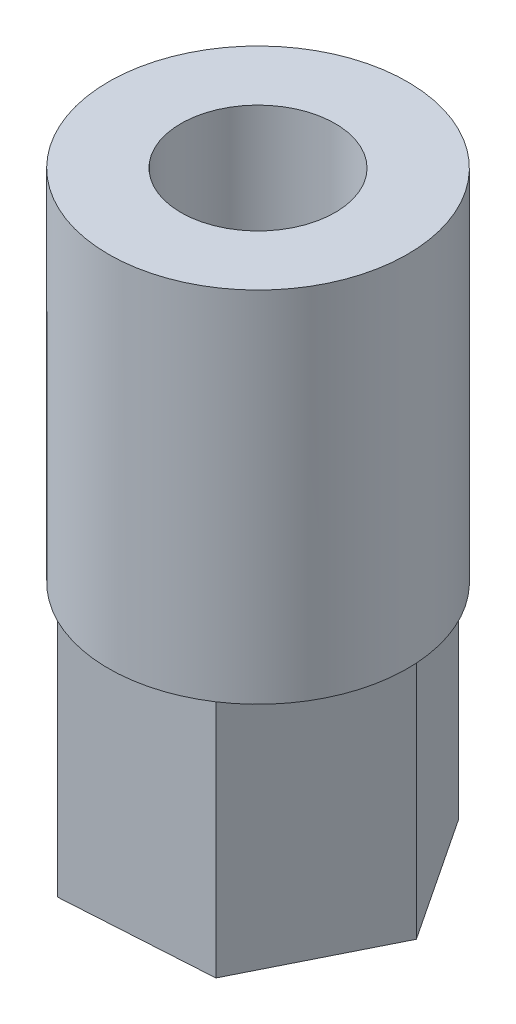
ISO-10303-21;
HEADER;
FILE_DESCRIPTION(('STEP AP214'),'2;1');
FILE_NAME('part.step','',(''),(''),'','','');
FILE_SCHEMA(('AUTOMOTIVE_DESIGN { 1 0 10303 214 1 1 1 1 }'));
ENDSEC;
DATA;
#1=APPLICATION_CONTEXT('core data for automotive mechanical design processes');
#2=APPLICATION_PROTOCOL_DEFINITION('international standard','automotive_design',2000,#1);
#3=PRODUCT_CONTEXT('',#1,'mechanical');
#4=PRODUCT('Part','Part','',(#3));
#5=PRODUCT_RELATED_PRODUCT_CATEGORY('part','',(#4));
#6=PRODUCT_DEFINITION_FORMATION('','',#4);
#7=PRODUCT_DEFINITION_CONTEXT('part definition',#1,'design');
#8=PRODUCT_DEFINITION('design','',#6,#7);
#9=PRODUCT_DEFINITION_SHAPE('','',#8);
#10=(LENGTH_UNIT() NAMED_UNIT(*) SI_UNIT(.MILLI.,.METRE.));
#11=(NAMED_UNIT(*) PLANE_ANGLE_UNIT() SI_UNIT($,.RADIAN.));
#12=(NAMED_UNIT(*) SI_UNIT($,.STERADIAN.) SOLID_ANGLE_UNIT());
#13=UNCERTAINTY_MEASURE_WITH_UNIT(LENGTH_MEASURE(1.E-05),#10,'distance_accuracy_value','');
#14=(GEOMETRIC_REPRESENTATION_CONTEXT(3) GLOBAL_UNCERTAINTY_ASSIGNED_CONTEXT((#13)) GLOBAL_UNIT_ASSIGNED_CONTEXT((#10,
#11,#12)) REPRESENTATION_CONTEXT('',''));
#15=CARTESIAN_POINT('',(0.,0.,0.));
#16=DIRECTION('',(0.,0.,1.));
#17=DIRECTION('',(1.,0.,0.));
#18=AXIS2_PLACEMENT_3D('',#15,#16,#17);
#19=CARTESIAN_POINT('',(0.,0.,0.));
#20=DIRECTION('',(0.,1.,0.));
#21=DIRECTION('',(0.,0.,1.));
#22=AXIS2_PLACEMENT_3D('',#19,#20,#21);
#23=PLANE('',#22);
#24=DIRECTION('',(-0.998134620038051,0.,0.0610514560145483));
#25=VECTOR('',#24,1.);
#26=CARTESIAN_POINT('',(1.75240766442344,0.,2.64758236466214));
#27=LINE('',#26,#25);
#28=CARTESIAN_POINT('',(1.75240766442344,0.,2.64758236466214));
#29=VERTEX_POINT('',#28);
#30=CARTESIAN_POINT('',(-1.41666975419736,0.,2.84142073750833));
#31=VERTEX_POINT('',#30);
#32=EDGE_CURVE('E112',#29,#31,#27,.T.);
#33=ORIENTED_EDGE('',*,*,#32,.F.);
#34=CARTESIAN_POINT('',(0.,0.,0.));
#35=DIRECTION('',(0.,1.,0.));
#36=DIRECTION('',(0.,0.,1.));
#37=AXIS2_PLACEMENT_3D('',#34,#35,#36);
#38=CIRCLE('',#37,3.175);
#39=EDGE_CURVE('E113',#31,#29,#38,.T.);
#40=ORIENTED_EDGE('',*,*,#39,.F.);
#41=EDGE_LOOP('',(#33,#40));
#42=FACE_BOUND('',#41,.T.);
#43=ADVANCED_FACE('F34',(#42),#23,.F.);
#44=DIRECTION('',(-0.446195198172399,0.,0.894935665356954));
#45=VECTOR('',#44,1.);
#46=CARTESIAN_POINT('',(3.16907741862081,0.,-0.193838372846189));
#47=LINE('',#46,#45);
#48=CARTESIAN_POINT('',(3.16907741862081,0.,-0.193838372846187));
#49=VERTEX_POINT('',#48);
#50=EDGE_CURVE('E109',#49,#29,#47,.T.);
#51=ORIENTED_EDGE('',*,*,#50,.F.);
#52=EDGE_CURVE('E38',#29,#49,#38,.T.);
#53=ORIENTED_EDGE('',*,*,#52,.F.);
#54=EDGE_LOOP('',(#51,#53));
#55=FACE_BOUND('',#54,.T.);
#56=ADVANCED_FACE('F187',(#55),#23,.F.);
#57=DIRECTION('',(0.551939421865652,0.,0.833884209342406));
#58=VECTOR('',#57,1.);
#59=CARTESIAN_POINT('',(1.41666975419736,0.,-2.84142073750833));
#60=LINE('',#59,#58);
#61=CARTESIAN_POINT('',(1.41666975419736,0.,-2.84142073750833));
#62=VERTEX_POINT('',#61);
#63=EDGE_CURVE('E132',#62,#49,#60,.T.);
#64=ORIENTED_EDGE('',*,*,#63,.F.);
#65=EDGE_CURVE('E176',#49,#62,#38,.T.);
#66=ORIENTED_EDGE('',*,*,#65,.F.);
#67=EDGE_LOOP('',(#64,#66));
#68=FACE_BOUND('',#67,.T.);
#69=ADVANCED_FACE('F188',(#68),#23,.F.);
#70=DIRECTION('',(0.998134620038051,0.,-0.0610514560145496));
#71=VECTOR('',#70,1.);
#72=CARTESIAN_POINT('',(-1.75240766442345,0.,-2.64758236466213));
#73=LINE('',#72,#71);
#74=CARTESIAN_POINT('',(-1.75240766442344,0.,-2.64758236466214));
#75=VERTEX_POINT('',#74);
#76=EDGE_CURVE('E55',#75,#62,#73,.T.);
#77=ORIENTED_EDGE('',*,*,#76,.F.);
#78=EDGE_CURVE('E189',#62,#75,#38,.T.);
#79=ORIENTED_EDGE('',*,*,#78,.F.);
#80=EDGE_LOOP('',(#77,#79));
#81=FACE_BOUND('',#80,.T.);
#82=ADVANCED_FACE('F217',(#81),#23,.F.);
#83=DIRECTION('',(0.446195198172398,0.,-0.894935665356955));
#84=VECTOR('',#83,1.);
#85=CARTESIAN_POINT('',(-3.16907741862081,0.,0.193838372846192));
#86=LINE('',#85,#84);
#87=CARTESIAN_POINT('',(-3.16907741862081,0.,0.193838372846192));
#88=VERTEX_POINT('',#87);
#89=EDGE_CURVE('E136',#88,#75,#86,.T.);
#90=ORIENTED_EDGE('',*,*,#89,.F.);
#91=EDGE_CURVE('E190',#75,#88,#38,.T.);
#92=ORIENTED_EDGE('',*,*,#91,.F.);
#93=EDGE_LOOP('',(#90,#92));
#94=FACE_BOUND('',#93,.T.);
#95=ADVANCED_FACE('F193',(#94),#23,.F.);
#96=DIRECTION('',(-0.551939421865652,0.,-0.833884209342406));
#97=VECTOR('',#96,1.);
#98=CARTESIAN_POINT('',(-1.41666975419736,0.,2.84142073750833));
#99=LINE('',#98,#97);
#100=EDGE_CURVE('E48',#31,#88,#99,.T.);
#101=ORIENTED_EDGE('',*,*,#100,.F.);
#102=EDGE_CURVE('E116',#88,#31,#38,.T.);
#103=ORIENTED_EDGE('',*,*,#102,.F.);
#104=EDGE_LOOP('',(#101,#103));
#105=FACE_BOUND('',#104,.T.);
#106=ADVANCED_FACE('F170',(#105),#23,.F.);
#107=CARTESIAN_POINT('',(0.,7.62,0.));
#108=DIRECTION('',(0.,-1.,0.));
#109=DIRECTION('',(0.,0.,-1.));
#110=AXIS2_PLACEMENT_3D('',#107,#108,#109);
#111=CYLINDRICAL_SURFACE('',#110,3.175);
#112=CARTESIAN_POINT('',(0.,7.62,0.));
#113=DIRECTION('',(0.,1.,0.));
#114=DIRECTION('',(0.,0.,1.));
#115=AXIS2_PLACEMENT_3D('',#112,#113,#114);
#116=CIRCLE('',#115,3.175);
#117=CARTESIAN_POINT('',(0.,7.62,3.175));
#118=VERTEX_POINT('',#117);
#119=EDGE_CURVE('E11',#118,#118,#116,.T.);
#120=ORIENTED_EDGE('',*,*,#119,.F.);
#121=EDGE_LOOP('',(#120));
#122=FACE_BOUND('',#121,.T.);
#123=ORIENTED_EDGE('',*,*,#52,.T.);
#124=ORIENTED_EDGE('',*,*,#65,.T.);
#125=ORIENTED_EDGE('',*,*,#78,.T.);
#126=ORIENTED_EDGE('',*,*,#91,.T.);
#127=ORIENTED_EDGE('',*,*,#102,.T.);
#128=ORIENTED_EDGE('',*,*,#39,.T.);
#129=EDGE_LOOP('',(#123,#124,#125,#126,#127,#128));
#130=FACE_BOUND('',#129,.T.);
#131=ADVANCED_FACE('F36',(#122,#130),#111,.T.);
#132=CARTESIAN_POINT('',(0.,7.62,0.));
#133=DIRECTION('',(0.,1.,0.));
#134=DIRECTION('',(0.,0.,1.));
#135=AXIS2_PLACEMENT_3D('',#132,#133,#134);
#136=PLANE('',#135);
#137=CARTESIAN_POINT('',(0.,7.62,0.));
#138=DIRECTION('',(0.,1.,0.));
#139=DIRECTION('',(0.,0.,1.));
#140=AXIS2_PLACEMENT_3D('',#137,#138,#139);
#141=CIRCLE('',#140,1.6383);
#142=CARTESIAN_POINT('',(0.,7.62,1.6383));
#143=VERTEX_POINT('',#142);
#144=EDGE_CURVE('E148',#143,#143,#141,.T.);
#145=ORIENTED_EDGE('',*,*,#144,.F.);
#146=EDGE_LOOP('',(#145));
#147=FACE_BOUND('',#146,.T.);
#148=ORIENTED_EDGE('',*,*,#119,.T.);
#149=EDGE_LOOP('',(#148));
#150=FACE_BOUND('',#149,.T.);
#151=ADVANCED_FACE('F162',(#147,#150),#136,.T.);
#152=CARTESIAN_POINT('',(1.75240766442344,-5.08,2.64758236466214));
#153=DIRECTION('',(-0.0610514560145483,0.,-0.998134620038051));
#154=DIRECTION('',(-0.998134620038051,0.,0.0610514560145483));
#155=AXIS2_PLACEMENT_3D('',#152,#153,#154);
#156=PLANE('',#155);
#157=ORIENTED_EDGE('',*,*,#32,.T.);
#158=DIRECTION('',(0.,1.,0.));
#159=VECTOR('',#158,1.);
#160=CARTESIAN_POINT('',(-1.41666975419736,-5.08,2.84142073750833));
#161=LINE('',#160,#159);
#162=CARTESIAN_POINT('',(-1.41666975419736,-5.08,2.84142073750833));
#163=VERTEX_POINT('',#162);
#164=EDGE_CURVE('E93',#163,#31,#161,.T.);
#165=ORIENTED_EDGE('',*,*,#164,.F.);
#166=DIRECTION('',(-0.998134620038051,0.,0.0610514560145483));
#167=VECTOR('',#166,1.);
#168=CARTESIAN_POINT('',(1.75240766442344,-5.08,2.64758236466214));
#169=LINE('',#168,#167);
#170=CARTESIAN_POINT('',(1.75240766442344,-5.08,2.64758236466214));
#171=VERTEX_POINT('',#170);
#172=EDGE_CURVE('E100',#171,#163,#169,.T.);
#173=ORIENTED_EDGE('',*,*,#172,.F.);
#174=DIRECTION('',(0.,1.,0.));
#175=VECTOR('',#174,1.);
#176=CARTESIAN_POINT('',(1.75240766442344,-5.08,2.64758236466214));
#177=LINE('',#176,#175);
#178=EDGE_CURVE('E128',#171,#29,#177,.T.);
#179=ORIENTED_EDGE('',*,*,#178,.T.);
#180=EDGE_LOOP('',(#157,#165,#173,#179));
#181=FACE_BOUND('',#180,.T.);
#182=ADVANCED_FACE('F111',(#181),#156,.F.);
#183=CARTESIAN_POINT('',(-1.41666975419736,-5.08,2.84142073750833));
#184=DIRECTION('',(0.833884209342406,0.,-0.551939421865652));
#185=DIRECTION('',(-0.551939421865652,0.,-0.833884209342406));
#186=AXIS2_PLACEMENT_3D('',#183,#184,#185);
#187=PLANE('',#186);
#188=ORIENTED_EDGE('',*,*,#100,.T.);
#189=DIRECTION('',(0.,1.,0.));
#190=VECTOR('',#189,1.);
#191=CARTESIAN_POINT('',(-3.16907741862081,-5.08,0.193838372846192));
#192=LINE('',#191,#190);
#193=CARTESIAN_POINT('',(-3.16907741862081,-5.08,0.193838372846192));
#194=VERTEX_POINT('',#193);
#195=EDGE_CURVE('E96',#194,#88,#192,.T.);
#196=ORIENTED_EDGE('',*,*,#195,.F.);
#197=DIRECTION('',(-0.551939421865652,0.,-0.833884209342406));
#198=VECTOR('',#197,1.);
#199=CARTESIAN_POINT('',(-1.41666975419736,-5.08,2.84142073750833));
#200=LINE('',#199,#198);
#201=EDGE_CURVE('E89',#163,#194,#200,.T.);
#202=ORIENTED_EDGE('',*,*,#201,.F.);
#203=ORIENTED_EDGE('',*,*,#164,.T.);
#204=EDGE_LOOP('',(#188,#196,#202,#203));
#205=FACE_BOUND('',#204,.T.);
#206=ADVANCED_FACE('F91',(#205),#187,.F.);
#207=CARTESIAN_POINT('',(-3.16907741862081,-5.08,0.193838372846192));
#208=DIRECTION('',(0.894935665356954,0.,0.446195198172398));
#209=DIRECTION('',(0.446195198172398,0.,-0.894935665356954));
#210=AXIS2_PLACEMENT_3D('',#207,#208,#209);
#211=PLANE('',#210);
#212=ORIENTED_EDGE('',*,*,#89,.T.);
#213=DIRECTION('',(0.,1.,0.));
#214=VECTOR('',#213,1.);
#215=CARTESIAN_POINT('',(-1.75240766442345,-5.08,-2.64758236466213));
#216=LINE('',#215,#214);
#217=CARTESIAN_POINT('',(-1.75240766442345,-5.08,-2.64758236466213));
#218=VERTEX_POINT('',#217);
#219=EDGE_CURVE('E117',#218,#75,#216,.T.);
#220=ORIENTED_EDGE('',*,*,#219,.F.);
#221=DIRECTION('',(0.446195198172398,0.,-0.894935665356955));
#222=VECTOR('',#221,1.);
#223=CARTESIAN_POINT('',(-3.16907741862081,-5.08,0.193838372846192));
#224=LINE('',#223,#222);
#225=EDGE_CURVE('E99',#194,#218,#224,.T.);
#226=ORIENTED_EDGE('',*,*,#225,.F.);
#227=ORIENTED_EDGE('',*,*,#195,.T.);
#228=EDGE_LOOP('',(#212,#220,#226,#227));
#229=FACE_BOUND('',#228,.T.);
#230=ADVANCED_FACE('F196',(#229),#211,.F.);
#231=CARTESIAN_POINT('',(-1.75240766442345,-5.08,-2.64758236466213));
#232=DIRECTION('',(0.0610514560145496,0.,0.99813462003805));
#233=DIRECTION('',(0.998134620038051,0.,-0.0610514560145496));
#234=AXIS2_PLACEMENT_3D('',#231,#232,#233);
#235=PLANE('',#234);
#236=ORIENTED_EDGE('',*,*,#76,.T.);
#237=DIRECTION('',(0.,1.,0.));
#238=VECTOR('',#237,1.);
#239=CARTESIAN_POINT('',(1.41666975419736,-5.08,-2.84142073750833));
#240=LINE('',#239,#238);
#241=CARTESIAN_POINT('',(1.41666975419736,-5.08,-2.84142073750833));
#242=VERTEX_POINT('',#241);
#243=EDGE_CURVE('E122',#242,#62,#240,.T.);
#244=ORIENTED_EDGE('',*,*,#243,.F.);
#245=DIRECTION('',(0.998134620038051,0.,-0.0610514560145496));
#246=VECTOR('',#245,1.);
#247=CARTESIAN_POINT('',(-1.75240766442345,-5.08,-2.64758236466213));
#248=LINE('',#247,#246);
#249=EDGE_CURVE('E145',#218,#242,#248,.T.);
#250=ORIENTED_EDGE('',*,*,#249,.F.);
#251=ORIENTED_EDGE('',*,*,#219,.T.);
#252=EDGE_LOOP('',(#236,#244,#250,#251));
#253=FACE_BOUND('',#252,.T.);
#254=ADVANCED_FACE('F199',(#253),#235,.F.);
#255=CARTESIAN_POINT('',(1.41666975419736,-5.08,-2.84142073750833));
#256=DIRECTION('',(-0.833884209342406,0.,0.551939421865652));
#257=DIRECTION('',(0.551939421865652,0.,0.833884209342406));
#258=AXIS2_PLACEMENT_3D('',#255,#256,#257);
#259=PLANE('',#258);
#260=ORIENTED_EDGE('',*,*,#63,.T.);
#261=DIRECTION('',(0.,1.,0.));
#262=VECTOR('',#261,1.);
#263=CARTESIAN_POINT('',(3.16907741862081,-5.08,-0.193838372846189));
#264=LINE('',#263,#262);
#265=CARTESIAN_POINT('',(3.16907741862081,-5.08,-0.193838372846189));
#266=VERTEX_POINT('',#265);
#267=EDGE_CURVE('E125',#266,#49,#264,.T.);
#268=ORIENTED_EDGE('',*,*,#267,.F.);
#269=DIRECTION('',(0.551939421865652,0.,0.833884209342406));
#270=VECTOR('',#269,1.);
#271=CARTESIAN_POINT('',(1.41666975419736,-5.08,-2.84142073750833));
#272=LINE('',#271,#270);
#273=EDGE_CURVE('E143',#242,#266,#272,.T.);
#274=ORIENTED_EDGE('',*,*,#273,.F.);
#275=ORIENTED_EDGE('',*,*,#243,.T.);
#276=EDGE_LOOP('',(#260,#268,#274,#275));
#277=FACE_BOUND('',#276,.T.);
#278=ADVANCED_FACE('F181',(#277),#259,.F.);
#279=CARTESIAN_POINT('',(3.16907741862081,-5.08,-0.193838372846189));
#280=DIRECTION('',(-0.894935665356954,0.,-0.446195198172399));
#281=DIRECTION('',(-0.446195198172399,0.,0.894935665356954));
#282=AXIS2_PLACEMENT_3D('',#279,#280,#281);
#283=PLANE('',#282);
#284=ORIENTED_EDGE('',*,*,#50,.T.);
#285=ORIENTED_EDGE('',*,*,#178,.F.);
#286=DIRECTION('',(-0.446195198172399,0.,0.894935665356954));
#287=VECTOR('',#286,1.);
#288=CARTESIAN_POINT('',(3.16907741862081,-5.08,-0.193838372846189));
#289=LINE('',#288,#287);
#290=EDGE_CURVE('E105',#266,#171,#289,.T.);
#291=ORIENTED_EDGE('',*,*,#290,.F.);
#292=ORIENTED_EDGE('',*,*,#267,.T.);
#293=EDGE_LOOP('',(#284,#285,#291,#292));
#294=FACE_BOUND('',#293,.T.);
#295=ADVANCED_FACE('F186',(#294),#283,.F.);
#296=CARTESIAN_POINT('',(0.,-5.08,0.));
#297=DIRECTION('',(0.,-1.,0.));
#298=DIRECTION('',(0.,0.,-1.));
#299=AXIS2_PLACEMENT_3D('',#296,#297,#298);
#300=PLANE('',#299);
#301=ORIENTED_EDGE('',*,*,#172,.T.);
#302=ORIENTED_EDGE('',*,*,#201,.T.);
#303=ORIENTED_EDGE('',*,*,#225,.T.);
#304=ORIENTED_EDGE('',*,*,#249,.T.);
#305=ORIENTED_EDGE('',*,*,#273,.T.);
#306=ORIENTED_EDGE('',*,*,#290,.T.);
#307=EDGE_LOOP('',(#301,#302,#303,#304,#305,#306));
#308=FACE_BOUND('',#307,.T.);
#309=ADVANCED_FACE('F103',(#308),#300,.T.);
#310=CARTESIAN_POINT('',(0.,-1.27,0.));
#311=DIRECTION('',(0.,1.,0.));
#312=DIRECTION('',(0.,0.,1.));
#313=AXIS2_PLACEMENT_3D('',#310,#311,#312);
#314=CYLINDRICAL_SURFACE('',#313,1.6383);
#315=CARTESIAN_POINT('',(0.,-1.27,0.));
#316=DIRECTION('',(0.,1.,0.));
#317=DIRECTION('',(0.,0.,1.));
#318=AXIS2_PLACEMENT_3D('',#315,#316,#317);
#319=CIRCLE('',#318,1.6383);
#320=CARTESIAN_POINT('',(0.,-1.27,1.6383));
#321=VERTEX_POINT('',#320);
#322=EDGE_CURVE('E141',#321,#321,#319,.T.);
#323=ORIENTED_EDGE('',*,*,#322,.F.);
#324=EDGE_LOOP('',(#323));
#325=FACE_BOUND('',#324,.T.);
#326=ORIENTED_EDGE('',*,*,#144,.T.);
#327=EDGE_LOOP('',(#326));
#328=FACE_BOUND('',#327,.T.);
#329=ADVANCED_FACE('F156',(#325,#328),#314,.F.);
#330=CARTESIAN_POINT('',(0.,-1.27,0.));
#331=DIRECTION('',(0.,1.,0.));
#332=DIRECTION('',(0.,0.,1.));
#333=AXIS2_PLACEMENT_3D('',#330,#331,#332);
#334=PLANE('',#333);
#335=ORIENTED_EDGE('',*,*,#322,.T.);
#336=EDGE_LOOP('',(#335));
#337=FACE_BOUND('',#336,.T.);
#338=ADVANCED_FACE('F154',(#337),#334,.T.);
#339=CLOSED_SHELL('',(#43,#56,#69,#82,#95,#106,#131,#151,#182,#206,#230,#254,#278,#295,#309,
#329,#338));
#340=MANIFOLD_SOLID_BREP('B2',#339);
#341=ADVANCED_BREP_SHAPE_REPRESENTATION('',(#18,#340),#14);
#342=SHAPE_DEFINITION_REPRESENTATION(#9,#341);
ENDSEC;
END-ISO-10303-21;
